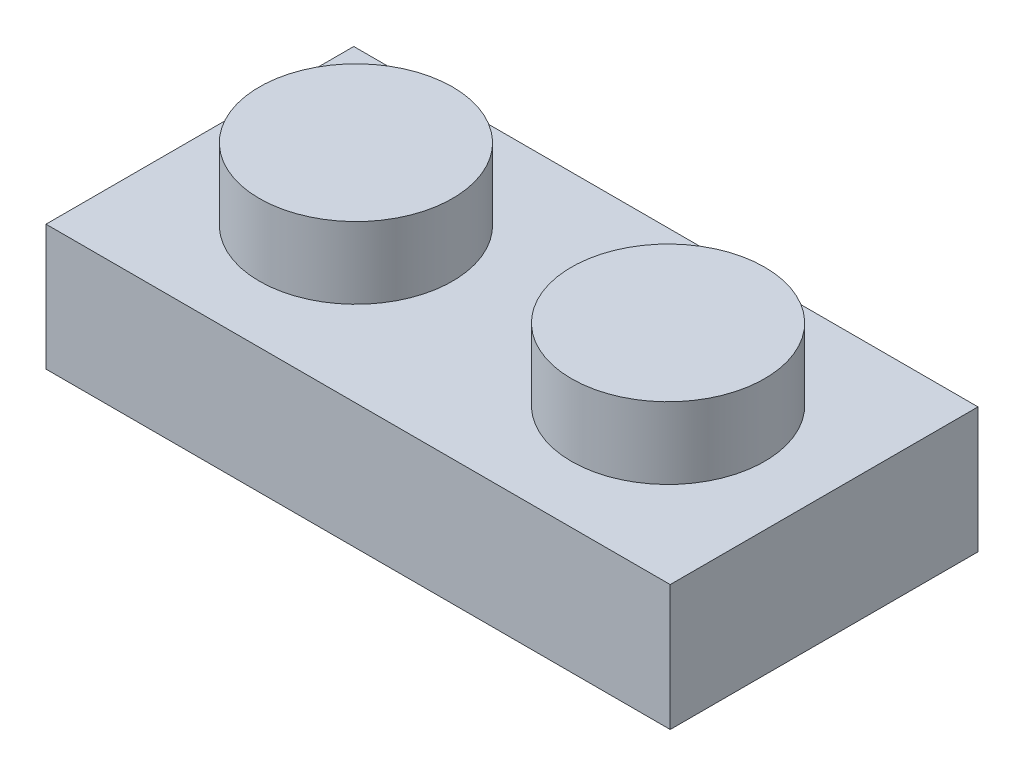
ISO-10303-21;
HEADER;
FILE_DESCRIPTION(('STEP AP214'),'2;1');
FILE_NAME('part.step','',(''),(''),'','','');
FILE_SCHEMA(('AUTOMOTIVE_DESIGN { 1 0 10303 214 1 1 1 1 }'));
ENDSEC;
DATA;
#1=APPLICATION_CONTEXT('core data for automotive mechanical design processes');
#2=APPLICATION_PROTOCOL_DEFINITION('international standard','automotive_design',2000,#1);
#3=PRODUCT_CONTEXT('',#1,'mechanical');
#4=PRODUCT('Part','Part','',(#3));
#5=PRODUCT_RELATED_PRODUCT_CATEGORY('part','',(#4));
#6=PRODUCT_DEFINITION_FORMATION('','',#4);
#7=PRODUCT_DEFINITION_CONTEXT('part definition',#1,'design');
#8=PRODUCT_DEFINITION('design','',#6,#7);
#9=PRODUCT_DEFINITION_SHAPE('','',#8);
#10=(LENGTH_UNIT() NAMED_UNIT(*) SI_UNIT(.MILLI.,.METRE.));
#11=(NAMED_UNIT(*) PLANE_ANGLE_UNIT() SI_UNIT($,.RADIAN.));
#12=(NAMED_UNIT(*) SI_UNIT($,.STERADIAN.) SOLID_ANGLE_UNIT());
#13=UNCERTAINTY_MEASURE_WITH_UNIT(LENGTH_MEASURE(1.E-05),#10,'distance_accuracy_value','');
#14=(GEOMETRIC_REPRESENTATION_CONTEXT(3) GLOBAL_UNCERTAINTY_ASSIGNED_CONTEXT((#13)) GLOBAL_UNIT_ASSIGNED_CONTEXT((#10,
#11,#12)) REPRESENTATION_CONTEXT('',''));
#15=CARTESIAN_POINT('',(0.,0.,0.));
#16=DIRECTION('',(0.,0.,1.));
#17=DIRECTION('',(1.,0.,0.));
#18=AXIS2_PLACEMENT_3D('',#15,#16,#17);
#19=CARTESIAN_POINT('',(7.93,-3.19,-3.91));
#20=DIRECTION('',(1.,0.,0.));
#21=DIRECTION('',(0.,0.,-1.));
#22=AXIS2_PLACEMENT_3D('',#19,#20,#21);
#23=PLANE('',#22);
#24=DIRECTION('',(0.,0.,-1.));
#25=VECTOR('',#24,1.);
#26=CARTESIAN_POINT('',(7.93,0.,-3.91));
#27=LINE('',#26,#25);
#28=CARTESIAN_POINT('',(7.93,0.,3.91));
#29=VERTEX_POINT('',#28);
#30=CARTESIAN_POINT('',(7.93,0.,-3.91));
#31=VERTEX_POINT('',#30);
#32=EDGE_CURVE('E170',#29,#31,#27,.T.);
#33=ORIENTED_EDGE('',*,*,#32,.F.);
#34=DIRECTION('',(0.,1.,0.));
#35=VECTOR('',#34,1.);
#36=CARTESIAN_POINT('',(7.93,-3.19,3.91));
#37=LINE('',#36,#35);
#38=CARTESIAN_POINT('',(7.93,-3.19,3.91));
#39=VERTEX_POINT('',#38);
#40=EDGE_CURVE('E42',#39,#29,#37,.T.);
#41=ORIENTED_EDGE('',*,*,#40,.F.);
#42=DIRECTION('',(0.,0.,-1.));
#43=VECTOR('',#42,1.);
#44=CARTESIAN_POINT('',(7.93,-3.19,-3.91));
#45=LINE('',#44,#43);
#46=CARTESIAN_POINT('',(7.93,-3.19,-3.91));
#47=VERTEX_POINT('',#46);
#48=EDGE_CURVE('E173',#39,#47,#45,.T.);
#49=ORIENTED_EDGE('',*,*,#48,.T.);
#50=DIRECTION('',(0.,1.,0.));
#51=VECTOR('',#50,1.);
#52=CARTESIAN_POINT('',(7.93,-3.19,-3.91));
#53=LINE('',#52,#51);
#54=EDGE_CURVE('E83',#47,#31,#53,.T.);
#55=ORIENTED_EDGE('',*,*,#54,.T.);
#56=EDGE_LOOP('',(#33,#41,#49,#55));
#57=FACE_BOUND('',#56,.T.);
#58=ADVANCED_FACE('F35',(#57),#23,.T.);
#59=CARTESIAN_POINT('',(-7.93,-3.19,3.91));
#60=DIRECTION('',(0.,0.,1.));
#61=DIRECTION('',(1.,0.,0.));
#62=AXIS2_PLACEMENT_3D('',#59,#60,#61);
#63=PLANE('',#62);
#64=DIRECTION('',(1.,0.,0.));
#65=VECTOR('',#64,1.);
#66=CARTESIAN_POINT('',(-7.93,0.,3.91));
#67=LINE('',#66,#65);
#68=CARTESIAN_POINT('',(-7.93,0.,3.91));
#69=VERTEX_POINT('',#68);
#70=EDGE_CURVE('E176',#69,#29,#67,.T.);
#71=ORIENTED_EDGE('',*,*,#70,.F.);
#72=DIRECTION('',(0.,1.,0.));
#73=VECTOR('',#72,1.);
#74=CARTESIAN_POINT('',(-7.93,-3.19,3.91));
#75=LINE('',#74,#73);
#76=CARTESIAN_POINT('',(-7.93,-3.19,3.91));
#77=VERTEX_POINT('',#76);
#78=EDGE_CURVE('E194',#77,#69,#75,.T.);
#79=ORIENTED_EDGE('',*,*,#78,.F.);
#80=DIRECTION('',(1.,0.,0.));
#81=VECTOR('',#80,1.);
#82=CARTESIAN_POINT('',(-7.93,-3.19,3.91));
#83=LINE('',#82,#81);
#84=EDGE_CURVE('E181',#77,#39,#83,.T.);
#85=ORIENTED_EDGE('',*,*,#84,.T.);
#86=ORIENTED_EDGE('',*,*,#40,.T.);
#87=EDGE_LOOP('',(#71,#79,#85,#86));
#88=FACE_BOUND('',#87,.T.);
#89=ADVANCED_FACE('F201',(#88),#63,.T.);
#90=CARTESIAN_POINT('',(-7.93,-3.19,-3.91));
#91=DIRECTION('',(-1.,0.,0.));
#92=DIRECTION('',(0.,0.,1.));
#93=AXIS2_PLACEMENT_3D('',#90,#91,#92);
#94=PLANE('',#93);
#95=DIRECTION('',(0.,0.,1.));
#96=VECTOR('',#95,1.);
#97=CARTESIAN_POINT('',(-7.93,0.,-3.91));
#98=LINE('',#97,#96);
#99=CARTESIAN_POINT('',(-7.93,0.,-3.91));
#100=VERTEX_POINT('',#99);
#101=EDGE_CURVE('E188',#100,#69,#98,.T.);
#102=ORIENTED_EDGE('',*,*,#101,.F.);
#103=DIRECTION('',(0.,1.,0.));
#104=VECTOR('',#103,1.);
#105=CARTESIAN_POINT('',(-7.93,-3.19,-3.91));
#106=LINE('',#105,#104);
#107=CARTESIAN_POINT('',(-7.93,-3.19,-3.91));
#108=VERTEX_POINT('',#107);
#109=EDGE_CURVE('E196',#108,#100,#106,.T.);
#110=ORIENTED_EDGE('',*,*,#109,.F.);
#111=DIRECTION('',(0.,0.,1.));
#112=VECTOR('',#111,1.);
#113=CARTESIAN_POINT('',(-7.93,-3.19,-3.91));
#114=LINE('',#113,#112);
#115=EDGE_CURVE('E178',#108,#77,#114,.T.);
#116=ORIENTED_EDGE('',*,*,#115,.T.);
#117=ORIENTED_EDGE('',*,*,#78,.T.);
#118=EDGE_LOOP('',(#102,#110,#116,#117));
#119=FACE_BOUND('',#118,.T.);
#120=ADVANCED_FACE('F205',(#119),#94,.T.);
#121=CARTESIAN_POINT('',(-7.93,-3.19,-3.91));
#122=DIRECTION('',(0.,0.,-1.));
#123=DIRECTION('',(-1.,0.,0.));
#124=AXIS2_PLACEMENT_3D('',#121,#122,#123);
#125=PLANE('',#124);
#126=DIRECTION('',(-1.,0.,0.));
#127=VECTOR('',#126,1.);
#128=CARTESIAN_POINT('',(-7.93,0.,-3.91));
#129=LINE('',#128,#127);
#130=EDGE_CURVE('E185',#31,#100,#129,.T.);
#131=ORIENTED_EDGE('',*,*,#130,.F.);
#132=ORIENTED_EDGE('',*,*,#54,.F.);
#133=DIRECTION('',(-1.,0.,0.));
#134=VECTOR('',#133,1.);
#135=CARTESIAN_POINT('',(-7.93,-3.19,-3.91));
#136=LINE('',#135,#134);
#137=EDGE_CURVE('E175',#47,#108,#136,.T.);
#138=ORIENTED_EDGE('',*,*,#137,.T.);
#139=ORIENTED_EDGE('',*,*,#109,.T.);
#140=EDGE_LOOP('',(#131,#132,#138,#139));
#141=FACE_BOUND('',#140,.T.);
#142=ADVANCED_FACE('F197',(#141),#125,.T.);
#143=CARTESIAN_POINT('',(0.,-3.19,0.));
#144=DIRECTION('',(0.,1.,0.));
#145=DIRECTION('',(0.,0.,1.));
#146=AXIS2_PLACEMENT_3D('',#143,#144,#145);
#147=PLANE('',#146);
#148=DIRECTION('',(1.,0.,0.));
#149=VECTOR('',#148,1.);
#150=CARTESIAN_POINT('',(0.,-3.19,2.36));
#151=LINE('',#150,#149);
#152=CARTESIAN_POINT('',(-6.38,-3.19,2.36));
#153=VERTEX_POINT('',#152);
#154=CARTESIAN_POINT('',(6.38,-3.19,2.36));
#155=VERTEX_POINT('',#154);
#156=EDGE_CURVE('E156',#153,#155,#151,.T.);
#157=ORIENTED_EDGE('',*,*,#156,.T.);
#158=DIRECTION('',(0.,0.,-1.));
#159=VECTOR('',#158,1.);
#160=CARTESIAN_POINT('',(6.38,-3.19,0.));
#161=LINE('',#160,#159);
#162=CARTESIAN_POINT('',(6.38,-3.19,-2.36));
#163=VERTEX_POINT('',#162);
#164=EDGE_CURVE('E112',#155,#163,#161,.T.);
#165=ORIENTED_EDGE('',*,*,#164,.T.);
#166=DIRECTION('',(-1.,0.,0.));
#167=VECTOR('',#166,1.);
#168=CARTESIAN_POINT('',(0.,-3.19,-2.36));
#169=LINE('',#168,#167);
#170=CARTESIAN_POINT('',(-6.38,-3.19,-2.36));
#171=VERTEX_POINT('',#170);
#172=EDGE_CURVE('E134',#163,#171,#169,.T.);
#173=ORIENTED_EDGE('',*,*,#172,.T.);
#174=DIRECTION('',(0.,0.,1.));
#175=VECTOR('',#174,1.);
#176=CARTESIAN_POINT('',(-6.38,-3.19,0.));
#177=LINE('',#176,#175);
#178=EDGE_CURVE('E49',#171,#153,#177,.T.);
#179=ORIENTED_EDGE('',*,*,#178,.T.);
#180=EDGE_LOOP('',(#157,#165,#173,#179));
#181=FACE_BOUND('',#180,.T.);
#182=ORIENTED_EDGE('',*,*,#48,.F.);
#183=ORIENTED_EDGE('',*,*,#84,.F.);
#184=ORIENTED_EDGE('',*,*,#115,.F.);
#185=ORIENTED_EDGE('',*,*,#137,.F.);
#186=EDGE_LOOP('',(#182,#183,#184,#185));
#187=FACE_BOUND('',#186,.T.);
#188=ADVANCED_FACE('F207',(#181,#187),#147,.F.);
#189=CARTESIAN_POINT('',(0.,0.,0.));
#190=DIRECTION('',(0.,1.,0.));
#191=DIRECTION('',(0.,0.,1.));
#192=AXIS2_PLACEMENT_3D('',#189,#190,#191);
#193=PLANE('',#192);
#194=CARTESIAN_POINT('',(-3.965,0.,0.));
#195=DIRECTION('',(0.,1.,0.));
#196=DIRECTION('',(0.,0.,1.));
#197=AXIS2_PLACEMENT_3D('',#194,#195,#196);
#198=CIRCLE('',#197,2.455);
#199=CARTESIAN_POINT('',(-3.965,0.,2.455));
#200=VERTEX_POINT('',#199);
#201=EDGE_CURVE('E117',#200,#200,#198,.T.);
#202=ORIENTED_EDGE('',*,*,#201,.F.);
#203=EDGE_LOOP('',(#202));
#204=FACE_BOUND('',#203,.T.);
#205=CARTESIAN_POINT('',(3.965,0.,0.));
#206=DIRECTION('',(0.,1.,0.));
#207=DIRECTION('',(0.,0.,1.));
#208=AXIS2_PLACEMENT_3D('',#205,#206,#207);
#209=CIRCLE('',#208,2.455);
#210=CARTESIAN_POINT('',(3.965,0.,2.455));
#211=VERTEX_POINT('',#210);
#212=EDGE_CURVE('E164',#211,#211,#209,.T.);
#213=ORIENTED_EDGE('',*,*,#212,.F.);
#214=EDGE_LOOP('',(#213));
#215=FACE_BOUND('',#214,.T.);
#216=ORIENTED_EDGE('',*,*,#32,.T.);
#217=ORIENTED_EDGE('',*,*,#130,.T.);
#218=ORIENTED_EDGE('',*,*,#101,.T.);
#219=ORIENTED_EDGE('',*,*,#70,.T.);
#220=EDGE_LOOP('',(#216,#217,#218,#219));
#221=FACE_BOUND('',#220,.T.);
#222=ADVANCED_FACE('F200',(#204,#215,#221),#193,.T.);
#223=CARTESIAN_POINT('',(3.965,1.82,0.));
#224=DIRECTION('',(0.,-1.,0.));
#225=DIRECTION('',(0.,0.,-1.));
#226=AXIS2_PLACEMENT_3D('',#223,#224,#225);
#227=CYLINDRICAL_SURFACE('',#226,2.455);
#228=CARTESIAN_POINT('',(3.965,1.82,0.));
#229=DIRECTION('',(0.,1.,0.));
#230=DIRECTION('',(0.,0.,1.));
#231=AXIS2_PLACEMENT_3D('',#228,#229,#230);
#232=CIRCLE('',#231,2.455);
#233=CARTESIAN_POINT('',(3.965,1.82,2.455));
#234=VERTEX_POINT('',#233);
#235=EDGE_CURVE('E167',#234,#234,#232,.T.);
#236=ORIENTED_EDGE('',*,*,#235,.F.);
#237=EDGE_LOOP('',(#236));
#238=FACE_BOUND('',#237,.T.);
#239=ORIENTED_EDGE('',*,*,#212,.T.);
#240=EDGE_LOOP('',(#239));
#241=FACE_BOUND('',#240,.T.);
#242=ADVANCED_FACE('F215',(#238,#241),#227,.T.);
#243=CARTESIAN_POINT('',(3.965,1.82,0.));
#244=DIRECTION('',(0.,1.,0.));
#245=DIRECTION('',(0.,0.,1.));
#246=AXIS2_PLACEMENT_3D('',#243,#244,#245);
#247=PLANE('',#246);
#248=ORIENTED_EDGE('',*,*,#235,.T.);
#249=EDGE_LOOP('',(#248));
#250=FACE_BOUND('',#249,.T.);
#251=ADVANCED_FACE('F250',(#250),#247,.T.);
#252=CARTESIAN_POINT('',(-3.965,1.82,0.));
#253=DIRECTION('',(0.,-1.,0.));
#254=DIRECTION('',(0.,0.,-1.));
#255=AXIS2_PLACEMENT_3D('',#252,#253,#254);
#256=CYLINDRICAL_SURFACE('',#255,2.455);
#257=CARTESIAN_POINT('',(-3.965,1.82,0.));
#258=DIRECTION('',(0.,1.,0.));
#259=DIRECTION('',(0.,0.,1.));
#260=AXIS2_PLACEMENT_3D('',#257,#258,#259);
#261=CIRCLE('',#260,2.455);
#262=CARTESIAN_POINT('',(-3.965,1.82,2.455));
#263=VERTEX_POINT('',#262);
#264=EDGE_CURVE('E161',#263,#263,#261,.T.);
#265=ORIENTED_EDGE('',*,*,#264,.F.);
#266=EDGE_LOOP('',(#265));
#267=FACE_BOUND('',#266,.T.);
#268=ORIENTED_EDGE('',*,*,#201,.T.);
#269=EDGE_LOOP('',(#268));
#270=FACE_BOUND('',#269,.T.);
#271=ADVANCED_FACE('F259',(#267,#270),#256,.T.);
#272=CARTESIAN_POINT('',(-3.965,1.82,0.));
#273=DIRECTION('',(0.,1.,0.));
#274=DIRECTION('',(0.,0.,1.));
#275=AXIS2_PLACEMENT_3D('',#272,#273,#274);
#276=PLANE('',#275);
#277=ORIENTED_EDGE('',*,*,#264,.T.);
#278=EDGE_LOOP('',(#277));
#279=FACE_BOUND('',#278,.T.);
#280=ADVANCED_FACE('F269',(#279),#276,.T.);
#281=CARTESIAN_POINT('',(6.38,-3.19,-3.91));
#282=DIRECTION('',(1.,0.,0.));
#283=DIRECTION('',(0.,0.,-1.));
#284=AXIS2_PLACEMENT_3D('',#281,#282,#283);
#285=PLANE('',#284);
#286=DIRECTION('',(0.,0.,-1.));
#287=VECTOR('',#286,1.);
#288=CARTESIAN_POINT('',(6.38,-1.55,0.));
#289=LINE('',#288,#287);
#290=CARTESIAN_POINT('',(6.38,-1.55,2.36));
#291=VERTEX_POINT('',#290);
#292=CARTESIAN_POINT('',(6.38,-1.55,-2.36));
#293=VERTEX_POINT('',#292);
#294=EDGE_CURVE('E110',#291,#293,#289,.T.);
#295=ORIENTED_EDGE('',*,*,#294,.T.);
#296=DIRECTION('',(0.,1.,0.));
#297=VECTOR('',#296,1.);
#298=CARTESIAN_POINT('',(6.38,-3.19,-2.36));
#299=LINE('',#298,#297);
#300=EDGE_CURVE('E139',#163,#293,#299,.T.);
#301=ORIENTED_EDGE('',*,*,#300,.F.);
#302=ORIENTED_EDGE('',*,*,#164,.F.);
#303=DIRECTION('',(0.,1.,0.));
#304=VECTOR('',#303,1.);
#305=CARTESIAN_POINT('',(6.38,-3.19,2.36));
#306=LINE('',#305,#304);
#307=EDGE_CURVE('E107',#155,#291,#306,.T.);
#308=ORIENTED_EDGE('',*,*,#307,.T.);
#309=EDGE_LOOP('',(#295,#301,#302,#308));
#310=FACE_BOUND('',#309,.T.);
#311=ADVANCED_FACE('F109',(#310),#285,.F.);
#312=CARTESIAN_POINT('',(-7.93,-3.19,2.36));
#313=DIRECTION('',(0.,0.,1.));
#314=DIRECTION('',(1.,0.,0.));
#315=AXIS2_PLACEMENT_3D('',#312,#313,#314);
#316=PLANE('',#315);
#317=DIRECTION('',(1.,0.,0.));
#318=VECTOR('',#317,1.);
#319=CARTESIAN_POINT('',(0.,-1.55,2.36));
#320=LINE('',#319,#318);
#321=CARTESIAN_POINT('',(-6.38,-1.55,2.36));
#322=VERTEX_POINT('',#321);
#323=EDGE_CURVE('E125',#322,#291,#320,.T.);
#324=ORIENTED_EDGE('',*,*,#323,.T.);
#325=ORIENTED_EDGE('',*,*,#307,.F.);
#326=ORIENTED_EDGE('',*,*,#156,.F.);
#327=DIRECTION('',(0.,1.,0.));
#328=VECTOR('',#327,1.);
#329=CARTESIAN_POINT('',(-6.38,-3.19,2.36));
#330=LINE('',#329,#328);
#331=EDGE_CURVE('E118',#153,#322,#330,.T.);
#332=ORIENTED_EDGE('',*,*,#331,.T.);
#333=EDGE_LOOP('',(#324,#325,#326,#332));
#334=FACE_BOUND('',#333,.T.);
#335=ADVANCED_FACE('F130',(#334),#316,.F.);
#336=CARTESIAN_POINT('',(-6.38,-3.19,-3.91));
#337=DIRECTION('',(-1.,0.,0.));
#338=DIRECTION('',(0.,0.,1.));
#339=AXIS2_PLACEMENT_3D('',#336,#337,#338);
#340=PLANE('',#339);
#341=DIRECTION('',(0.,0.,1.));
#342=VECTOR('',#341,1.);
#343=CARTESIAN_POINT('',(-6.38,-1.55,0.));
#344=LINE('',#343,#342);
#345=CARTESIAN_POINT('',(-6.38,-1.55,-2.36));
#346=VERTEX_POINT('',#345);
#347=EDGE_CURVE('E132',#346,#322,#344,.T.);
#348=ORIENTED_EDGE('',*,*,#347,.T.);
#349=ORIENTED_EDGE('',*,*,#331,.F.);
#350=ORIENTED_EDGE('',*,*,#178,.F.);
#351=DIRECTION('',(0.,1.,0.));
#352=VECTOR('',#351,1.);
#353=CARTESIAN_POINT('',(-6.38,-3.19,-2.36));
#354=LINE('',#353,#352);
#355=EDGE_CURVE('E140',#171,#346,#354,.T.);
#356=ORIENTED_EDGE('',*,*,#355,.T.);
#357=EDGE_LOOP('',(#348,#349,#350,#356));
#358=FACE_BOUND('',#357,.T.);
#359=ADVANCED_FACE('F299',(#358),#340,.F.);
#360=CARTESIAN_POINT('',(-7.93,-3.19,-2.36));
#361=DIRECTION('',(0.,0.,-1.));
#362=DIRECTION('',(-1.,0.,0.));
#363=AXIS2_PLACEMENT_3D('',#360,#361,#362);
#364=PLANE('',#363);
#365=DIRECTION('',(-1.,0.,0.));
#366=VECTOR('',#365,1.);
#367=CARTESIAN_POINT('',(0.,-1.55,-2.36));
#368=LINE('',#367,#366);
#369=EDGE_CURVE('E127',#293,#346,#368,.T.);
#370=ORIENTED_EDGE('',*,*,#369,.T.);
#371=ORIENTED_EDGE('',*,*,#355,.F.);
#372=ORIENTED_EDGE('',*,*,#172,.F.);
#373=ORIENTED_EDGE('',*,*,#300,.T.);
#374=EDGE_LOOP('',(#370,#371,#372,#373));
#375=FACE_BOUND('',#374,.T.);
#376=ADVANCED_FACE('F308',(#375),#364,.F.);
#377=CARTESIAN_POINT('',(0.,-1.55,0.));
#378=DIRECTION('',(0.,1.,0.));
#379=DIRECTION('',(0.,0.,1.));
#380=AXIS2_PLACEMENT_3D('',#377,#378,#379);
#381=PLANE('',#380);
#382=CARTESIAN_POINT('',(0.,-1.55,0.));
#383=DIRECTION('',(0.,1.,0.));
#384=DIRECTION('',(0.,0.,1.));
#385=AXIS2_PLACEMENT_3D('',#382,#383,#384);
#386=CIRCLE('',#385,1.485);
#387=CARTESIAN_POINT('',(0.,-1.55,1.485));
#388=VERTEX_POINT('',#387);
#389=EDGE_CURVE('E12',#388,#388,#386,.F.);
#390=ORIENTED_EDGE('',*,*,#389,.F.);
#391=EDGE_LOOP('',(#390));
#392=FACE_BOUND('',#391,.T.);
#393=CARTESIAN_POINT('',(-3.965,-1.55,0.));
#394=DIRECTION('',(0.,1.,0.));
#395=DIRECTION('',(0.,0.,1.));
#396=AXIS2_PLACEMENT_3D('',#393,#394,#395);
#397=CIRCLE('',#396,0.905);
#398=CARTESIAN_POINT('',(-3.965,-1.55,0.905));
#399=VERTEX_POINT('',#398);
#400=EDGE_CURVE('E144',#399,#399,#397,.T.);
#401=ORIENTED_EDGE('',*,*,#400,.T.);
#402=EDGE_LOOP('',(#401));
#403=FACE_BOUND('',#402,.T.);
#404=CARTESIAN_POINT('',(3.965,-1.55,0.));
#405=DIRECTION('',(0.,1.,0.));
#406=DIRECTION('',(0.,0.,1.));
#407=AXIS2_PLACEMENT_3D('',#404,#405,#406);
#408=CIRCLE('',#407,0.905000000000001);
#409=CARTESIAN_POINT('',(3.965,-1.55,0.905000000000001));
#410=VERTEX_POINT('',#409);
#411=EDGE_CURVE('E149',#410,#410,#408,.T.);
#412=ORIENTED_EDGE('',*,*,#411,.T.);
#413=EDGE_LOOP('',(#412));
#414=FACE_BOUND('',#413,.T.);
#415=ORIENTED_EDGE('',*,*,#294,.F.);
#416=ORIENTED_EDGE('',*,*,#323,.F.);
#417=ORIENTED_EDGE('',*,*,#347,.F.);
#418=ORIENTED_EDGE('',*,*,#369,.F.);
#419=EDGE_LOOP('',(#415,#416,#417,#418));
#420=FACE_BOUND('',#419,.T.);
#421=ADVANCED_FACE('F123',(#392,#403,#414,#420),#381,.F.);
#422=CARTESIAN_POINT('',(3.965,1.82,0.));
#423=DIRECTION('',(0.,-1.,0.));
#424=DIRECTION('',(0.,0.,-1.));
#425=AXIS2_PLACEMENT_3D('',#422,#423,#424);
#426=CYLINDRICAL_SURFACE('',#425,0.905000000000001);
#427=CARTESIAN_POINT('',(3.965,0.27,0.));
#428=DIRECTION('',(0.,1.,0.));
#429=DIRECTION('',(0.,0.,1.));
#430=AXIS2_PLACEMENT_3D('',#427,#428,#429);
#431=CIRCLE('',#430,0.905000000000001);
#432=CARTESIAN_POINT('',(3.965,0.27,0.905000000000001));
#433=VERTEX_POINT('',#432);
#434=EDGE_CURVE('E128',#433,#433,#431,.T.);
#435=ORIENTED_EDGE('',*,*,#434,.T.);
#436=EDGE_LOOP('',(#435));
#437=FACE_BOUND('',#436,.T.);
#438=ORIENTED_EDGE('',*,*,#411,.F.);
#439=EDGE_LOOP('',(#438));
#440=FACE_BOUND('',#439,.T.);
#441=ADVANCED_FACE('F324',(#437,#440),#426,.F.);
#442=CARTESIAN_POINT('',(3.965,0.27,0.));
#443=DIRECTION('',(0.,1.,0.));
#444=DIRECTION('',(0.,0.,1.));
#445=AXIS2_PLACEMENT_3D('',#442,#443,#444);
#446=PLANE('',#445);
#447=ORIENTED_EDGE('',*,*,#434,.F.);
#448=EDGE_LOOP('',(#447));
#449=FACE_BOUND('',#448,.T.);
#450=ADVANCED_FACE('F329',(#449),#446,.F.);
#451=CARTESIAN_POINT('',(-3.965,1.82,0.));
#452=DIRECTION('',(0.,-1.,0.));
#453=DIRECTION('',(0.,0.,-1.));
#454=AXIS2_PLACEMENT_3D('',#451,#452,#453);
#455=CYLINDRICAL_SURFACE('',#454,0.905);
#456=CARTESIAN_POINT('',(-3.965,0.27,0.));
#457=DIRECTION('',(0.,1.,0.));
#458=DIRECTION('',(0.,0.,1.));
#459=AXIS2_PLACEMENT_3D('',#456,#457,#458);
#460=CIRCLE('',#459,0.905);
#461=CARTESIAN_POINT('',(-3.965,0.27,0.905));
#462=VERTEX_POINT('',#461);
#463=EDGE_CURVE('E147',#462,#462,#460,.T.);
#464=ORIENTED_EDGE('',*,*,#463,.T.);
#465=EDGE_LOOP('',(#464));
#466=FACE_BOUND('',#465,.T.);
#467=ORIENTED_EDGE('',*,*,#400,.F.);
#468=EDGE_LOOP('',(#467));
#469=FACE_BOUND('',#468,.T.);
#470=ADVANCED_FACE('F339',(#466,#469),#455,.F.);
#471=CARTESIAN_POINT('',(-3.965,0.27,0.));
#472=DIRECTION('',(0.,1.,0.));
#473=DIRECTION('',(0.,0.,1.));
#474=AXIS2_PLACEMENT_3D('',#471,#472,#473);
#475=PLANE('',#474);
#476=ORIENTED_EDGE('',*,*,#463,.F.);
#477=EDGE_LOOP('',(#476));
#478=FACE_BOUND('',#477,.T.);
#479=ADVANCED_FACE('F349',(#478),#475,.F.);
#480=CARTESIAN_POINT('',(0.,-7.39021428024809,0.));
#481=DIRECTION('',(0.,1.,0.));
#482=DIRECTION('',(0.,0.,1.));
#483=AXIS2_PLACEMENT_3D('',#480,#481,#482);
#484=CYLINDRICAL_SURFACE('',#483,1.485);
#485=CARTESIAN_POINT('',(0.,-2.99,0.));
#486=DIRECTION('',(0.,1.,0.));
#487=DIRECTION('',(0.,0.,1.));
#488=AXIS2_PLACEMENT_3D('',#485,#486,#487);
#489=CIRCLE('',#488,1.485);
#490=CARTESIAN_POINT('',(0.,-2.99,1.485));
#491=VERTEX_POINT('',#490);
#492=EDGE_CURVE('E413',#491,#491,#489,.T.);
#493=ORIENTED_EDGE('',*,*,#492,.T.);
#494=EDGE_LOOP('',(#493));
#495=FACE_BOUND('',#494,.T.);
#496=ORIENTED_EDGE('',*,*,#389,.T.);
#497=EDGE_LOOP('',(#496));
#498=FACE_BOUND('',#497,.T.);
#499=ADVANCED_FACE('F359',(#495,#498),#484,.T.);
#500=CARTESIAN_POINT('',(0.,-7.39021428024809,0.));
#501=DIRECTION('',(0.,1.,0.));
#502=DIRECTION('',(0.,0.,1.));
#503=AXIS2_PLACEMENT_3D('',#500,#501,#502);
#504=CYLINDRICAL_SURFACE('',#503,0.68);
#505=CARTESIAN_POINT('',(0.,-2.99,0.));
#506=DIRECTION('',(0.,1.,0.));
#507=DIRECTION('',(0.,0.,1.));
#508=AXIS2_PLACEMENT_3D('',#505,#506,#507);
#509=CIRCLE('',#508,0.68);
#510=CARTESIAN_POINT('',(0.,-2.99,0.68));
#511=VERTEX_POINT('',#510);
#512=EDGE_CURVE('E148',#511,#511,#509,.T.);
#513=ORIENTED_EDGE('',*,*,#512,.F.);
#514=EDGE_LOOP('',(#513));
#515=FACE_BOUND('',#514,.T.);
#516=CARTESIAN_POINT('',(0.,-1.55,0.));
#517=DIRECTION('',(0.,-1.,0.));
#518=DIRECTION('',(0.,0.,-1.));
#519=AXIS2_PLACEMENT_3D('',#516,#517,#518);
#520=CIRCLE('',#519,0.68);
#521=CARTESIAN_POINT('',(0.,-1.55,-0.68));
#522=VERTEX_POINT('',#521);
#523=EDGE_CURVE('E411',#522,#522,#520,.T.);
#524=ORIENTED_EDGE('',*,*,#523,.F.);
#525=EDGE_LOOP('',(#524));
#526=FACE_BOUND('',#525,.T.);
#527=ADVANCED_FACE('F378',(#515,#526),#504,.F.);
#528=CARTESIAN_POINT('',(0.,-2.99,0.));
#529=DIRECTION('',(0.,1.,0.));
#530=DIRECTION('',(0.,0.,1.));
#531=AXIS2_PLACEMENT_3D('',#528,#529,#530);
#532=PLANE('',#531);
#533=ORIENTED_EDGE('',*,*,#512,.T.);
#534=EDGE_LOOP('',(#533));
#535=FACE_BOUND('',#534,.T.);
#536=ORIENTED_EDGE('',*,*,#492,.F.);
#537=EDGE_LOOP('',(#536));
#538=FACE_BOUND('',#537,.T.);
#539=ADVANCED_FACE('F388',(#535,#538),#532,.F.);
#540=ORIENTED_EDGE('',*,*,#523,.T.);
#541=EDGE_LOOP('',(#540));
#542=FACE_BOUND('',#541,.T.);
#543=ADVANCED_FACE('F371',(#542),#381,.F.);
#544=CLOSED_SHELL('',(#58,#89,#120,#142,#188,#222,#242,#251,#271,#280,#311,#335,#359,#376,#421,
#441,#450,#470,#479,#499,#527,#539,#543));
#545=MANIFOLD_SOLID_BREP('B2',#544);
#546=ADVANCED_BREP_SHAPE_REPRESENTATION('',(#18,#545),#14);
#547=SHAPE_DEFINITION_REPRESENTATION(#9,#546);
ENDSEC;
END-ISO-10303-21;
